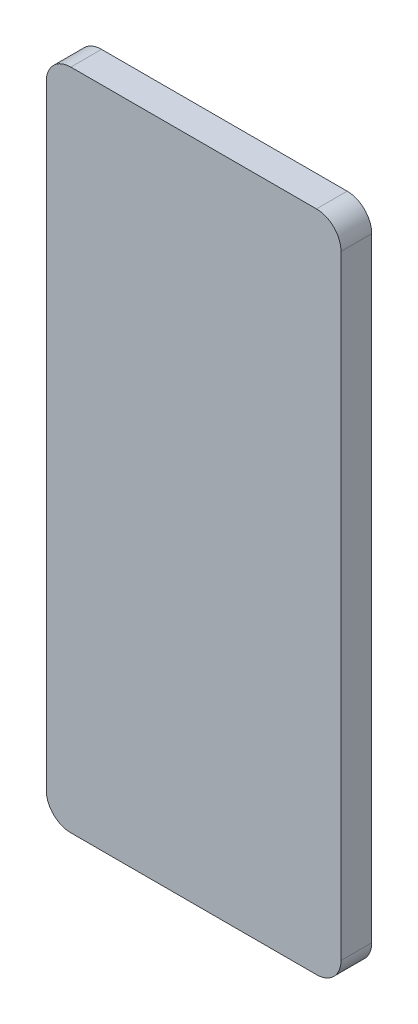
ISO-10303-21;
HEADER;
FILE_DESCRIPTION(('STEP AP214'),'2;1');
FILE_NAME('part.step','',(''),(''),'','','');
FILE_SCHEMA(('AUTOMOTIVE_DESIGN { 1 0 10303 214 1 1 1 1 }'));
ENDSEC;
DATA;
#1=APPLICATION_CONTEXT('core data for automotive mechanical design processes');
#2=APPLICATION_PROTOCOL_DEFINITION('international standard','automotive_design',2000,#1);
#3=PRODUCT_CONTEXT('',#1,'mechanical');
#4=PRODUCT('Part','Part','',(#3));
#5=PRODUCT_RELATED_PRODUCT_CATEGORY('part','',(#4));
#6=PRODUCT_DEFINITION_FORMATION('','',#4);
#7=PRODUCT_DEFINITION_CONTEXT('part definition',#1,'design');
#8=PRODUCT_DEFINITION('design','',#6,#7);
#9=PRODUCT_DEFINITION_SHAPE('','',#8);
#10=(LENGTH_UNIT() NAMED_UNIT(*) SI_UNIT(.MILLI.,.METRE.));
#11=(NAMED_UNIT(*) PLANE_ANGLE_UNIT() SI_UNIT($,.RADIAN.));
#12=(NAMED_UNIT(*) SI_UNIT($,.STERADIAN.) SOLID_ANGLE_UNIT());
#13=UNCERTAINTY_MEASURE_WITH_UNIT(LENGTH_MEASURE(1.E-05),#10,'distance_accuracy_value','');
#14=(GEOMETRIC_REPRESENTATION_CONTEXT(3) GLOBAL_UNCERTAINTY_ASSIGNED_CONTEXT((#13)) GLOBAL_UNIT_ASSIGNED_CONTEXT((#10,
#11,#12)) REPRESENTATION_CONTEXT('',''));
#15=CARTESIAN_POINT('',(0.,0.,0.));
#16=DIRECTION('',(0.,0.,1.));
#17=DIRECTION('',(1.,0.,0.));
#18=AXIS2_PLACEMENT_3D('',#15,#16,#17);
#19=CARTESIAN_POINT('',(-20.,-50.,-5.));
#20=DIRECTION('',(0.,0.,1.));
#21=DIRECTION('',(1.,0.,0.));
#22=AXIS2_PLACEMENT_3D('',#19,#20,#21);
#23=CYLINDRICAL_SURFACE('',#22,4.);
#24=CARTESIAN_POINT('',(-20.,-50.,0.));
#25=DIRECTION('',(0.,0.,1.));
#26=DIRECTION('',(-1.,0.,0.));
#27=AXIS2_PLACEMENT_3D('',#24,#25,#26);
#28=CIRCLE('',#27,4.);
#29=CARTESIAN_POINT('',(-24.,-50.,0.));
#30=VERTEX_POINT('',#29);
#31=CARTESIAN_POINT('',(-20.,-54.,0.));
#32=VERTEX_POINT('',#31);
#33=EDGE_CURVE('E133',#30,#32,#28,.T.);
#34=ORIENTED_EDGE('',*,*,#33,.F.);
#35=DIRECTION('',(0.,0.,1.));
#36=VECTOR('',#35,1.);
#37=CARTESIAN_POINT('',(-24.,-50.,-5.));
#38=LINE('',#37,#36);
#39=CARTESIAN_POINT('',(-24.,-50.,-5.));
#40=VERTEX_POINT('',#39);
#41=EDGE_CURVE('E11',#40,#30,#38,.T.);
#42=ORIENTED_EDGE('',*,*,#41,.F.);
#43=CARTESIAN_POINT('',(-20.,-50.,-5.));
#44=DIRECTION('',(0.,0.,1.));
#45=DIRECTION('',(-1.,0.,0.));
#46=AXIS2_PLACEMENT_3D('',#43,#44,#45);
#47=CIRCLE('',#46,4.);
#48=CARTESIAN_POINT('',(-20.,-54.,-5.));
#49=VERTEX_POINT('',#48);
#50=EDGE_CURVE('E153',#40,#49,#47,.T.);
#51=ORIENTED_EDGE('',*,*,#50,.T.);
#52=DIRECTION('',(0.,0.,1.));
#53=VECTOR('',#52,1.);
#54=CARTESIAN_POINT('',(-20.,-54.,-5.));
#55=LINE('',#54,#53);
#56=EDGE_CURVE('E39',#49,#32,#55,.T.);
#57=ORIENTED_EDGE('',*,*,#56,.T.);
#58=EDGE_LOOP('',(#34,#42,#51,#57));
#59=FACE_BOUND('',#58,.T.);
#60=ADVANCED_FACE('F36',(#59),#23,.T.);
#61=CARTESIAN_POINT('',(-24.,-50.,-5.));
#62=DIRECTION('',(-1.,0.,0.));
#63=DIRECTION('',(0.,0.,1.));
#64=AXIS2_PLACEMENT_3D('',#61,#62,#63);
#65=PLANE('',#64);
#66=DIRECTION('',(0.,-1.,0.));
#67=VECTOR('',#66,1.);
#68=CARTESIAN_POINT('',(-24.,-50.,0.));
#69=LINE('',#68,#67);
#70=CARTESIAN_POINT('',(-24.,50.,0.));
#71=VERTEX_POINT('',#70);
#72=EDGE_CURVE('E151',#71,#30,#69,.T.);
#73=ORIENTED_EDGE('',*,*,#72,.F.);
#74=DIRECTION('',(0.,0.,1.));
#75=VECTOR('',#74,1.);
#76=CARTESIAN_POINT('',(-24.,50.,-5.));
#77=LINE('',#76,#75);
#78=CARTESIAN_POINT('',(-24.,50.,-5.));
#79=VERTEX_POINT('',#78);
#80=EDGE_CURVE('E45',#79,#71,#77,.T.);
#81=ORIENTED_EDGE('',*,*,#80,.F.);
#82=DIRECTION('',(0.,-1.,0.));
#83=VECTOR('',#82,1.);
#84=CARTESIAN_POINT('',(-24.,-50.,-5.));
#85=LINE('',#84,#83);
#86=EDGE_CURVE('E123',#79,#40,#85,.T.);
#87=ORIENTED_EDGE('',*,*,#86,.T.);
#88=ORIENTED_EDGE('',*,*,#41,.T.);
#89=EDGE_LOOP('',(#73,#81,#87,#88));
#90=FACE_BOUND('',#89,.T.);
#91=ADVANCED_FACE('F165',(#90),#65,.T.);
#92=CARTESIAN_POINT('',(-20.,50.,-5.));
#93=DIRECTION('',(0.,0.,1.));
#94=DIRECTION('',(1.,0.,0.));
#95=AXIS2_PLACEMENT_3D('',#92,#93,#94);
#96=CYLINDRICAL_SURFACE('',#95,4.);
#97=CARTESIAN_POINT('',(-20.,50.,0.));
#98=DIRECTION('',(0.,0.,1.));
#99=DIRECTION('',(-1.,0.,0.));
#100=AXIS2_PLACEMENT_3D('',#97,#98,#99);
#101=CIRCLE('',#100,4.);
#102=CARTESIAN_POINT('',(-20.,54.,0.));
#103=VERTEX_POINT('',#102);
#104=EDGE_CURVE('E110',#103,#71,#101,.T.);
#105=ORIENTED_EDGE('',*,*,#104,.F.);
#106=DIRECTION('',(0.,0.,1.));
#107=VECTOR('',#106,1.);
#108=CARTESIAN_POINT('',(-20.,54.,-5.));
#109=LINE('',#108,#107);
#110=CARTESIAN_POINT('',(-20.,54.,-5.));
#111=VERTEX_POINT('',#110);
#112=EDGE_CURVE('E105',#111,#103,#109,.T.);
#113=ORIENTED_EDGE('',*,*,#112,.F.);
#114=CARTESIAN_POINT('',(-20.,50.,-5.));
#115=DIRECTION('',(0.,0.,1.));
#116=DIRECTION('',(-1.,0.,0.));
#117=AXIS2_PLACEMENT_3D('',#114,#115,#116);
#118=CIRCLE('',#117,4.);
#119=EDGE_CURVE('E108',#111,#79,#118,.T.);
#120=ORIENTED_EDGE('',*,*,#119,.T.);
#121=ORIENTED_EDGE('',*,*,#80,.T.);
#122=EDGE_LOOP('',(#105,#113,#120,#121));
#123=FACE_BOUND('',#122,.T.);
#124=ADVANCED_FACE('F107',(#123),#96,.T.);
#125=CARTESIAN_POINT('',(-20.,54.,-5.));
#126=DIRECTION('',(0.,1.,0.));
#127=DIRECTION('',(0.,0.,1.));
#128=AXIS2_PLACEMENT_3D('',#125,#126,#127);
#129=PLANE('',#128);
#130=DIRECTION('',(-1.,0.,0.));
#131=VECTOR('',#130,1.);
#132=CARTESIAN_POINT('',(-20.,54.,0.));
#133=LINE('',#132,#131);
#134=CARTESIAN_POINT('',(20.,54.,0.));
#135=VERTEX_POINT('',#134);
#136=EDGE_CURVE('E148',#135,#103,#133,.T.);
#137=ORIENTED_EDGE('',*,*,#136,.F.);
#138=DIRECTION('',(0.,0.,1.));
#139=VECTOR('',#138,1.);
#140=CARTESIAN_POINT('',(20.,54.,-5.));
#141=LINE('',#140,#139);
#142=CARTESIAN_POINT('',(20.,54.,-5.));
#143=VERTEX_POINT('',#142);
#144=EDGE_CURVE('E115',#143,#135,#141,.T.);
#145=ORIENTED_EDGE('',*,*,#144,.F.);
#146=DIRECTION('',(-1.,0.,0.));
#147=VECTOR('',#146,1.);
#148=CARTESIAN_POINT('',(-20.,54.,-5.));
#149=LINE('',#148,#147);
#150=EDGE_CURVE('E121',#143,#111,#149,.T.);
#151=ORIENTED_EDGE('',*,*,#150,.T.);
#152=ORIENTED_EDGE('',*,*,#112,.T.);
#153=EDGE_LOOP('',(#137,#145,#151,#152));
#154=FACE_BOUND('',#153,.T.);
#155=ADVANCED_FACE('F125',(#154),#129,.T.);
#156=CARTESIAN_POINT('',(20.,50.,-5.));
#157=DIRECTION('',(0.,0.,1.));
#158=DIRECTION('',(1.,0.,0.));
#159=AXIS2_PLACEMENT_3D('',#156,#157,#158);
#160=CYLINDRICAL_SURFACE('',#159,4.);
#161=CARTESIAN_POINT('',(20.,50.,0.));
#162=DIRECTION('',(0.,0.,1.));
#163=DIRECTION('',(-1.,0.,0.));
#164=AXIS2_PLACEMENT_3D('',#161,#162,#163);
#165=CIRCLE('',#164,4.);
#166=CARTESIAN_POINT('',(24.,50.,0.));
#167=VERTEX_POINT('',#166);
#168=EDGE_CURVE('E145',#167,#135,#165,.T.);
#169=ORIENTED_EDGE('',*,*,#168,.F.);
#170=DIRECTION('',(0.,0.,1.));
#171=VECTOR('',#170,1.);
#172=CARTESIAN_POINT('',(24.,50.,-5.));
#173=LINE('',#172,#171);
#174=CARTESIAN_POINT('',(24.,50.,-5.));
#175=VERTEX_POINT('',#174);
#176=EDGE_CURVE('E157',#175,#167,#173,.T.);
#177=ORIENTED_EDGE('',*,*,#176,.F.);
#178=CARTESIAN_POINT('',(20.,50.,-5.));
#179=DIRECTION('',(0.,0.,1.));
#180=DIRECTION('',(-1.,0.,0.));
#181=AXIS2_PLACEMENT_3D('',#178,#179,#180);
#182=CIRCLE('',#181,4.);
#183=EDGE_CURVE('E126',#175,#143,#182,.T.);
#184=ORIENTED_EDGE('',*,*,#183,.T.);
#185=ORIENTED_EDGE('',*,*,#144,.T.);
#186=EDGE_LOOP('',(#169,#177,#184,#185));
#187=FACE_BOUND('',#186,.T.);
#188=ADVANCED_FACE('F178',(#187),#160,.T.);
#189=CARTESIAN_POINT('',(24.,-50.,-5.));
#190=DIRECTION('',(1.,0.,0.));
#191=DIRECTION('',(0.,0.,-1.));
#192=AXIS2_PLACEMENT_3D('',#189,#190,#191);
#193=PLANE('',#192);
#194=DIRECTION('',(0.,1.,0.));
#195=VECTOR('',#194,1.);
#196=CARTESIAN_POINT('',(24.,-50.,0.));
#197=LINE('',#196,#195);
#198=CARTESIAN_POINT('',(24.,-50.,0.));
#199=VERTEX_POINT('',#198);
#200=EDGE_CURVE('E142',#199,#167,#197,.T.);
#201=ORIENTED_EDGE('',*,*,#200,.F.);
#202=DIRECTION('',(0.,0.,1.));
#203=VECTOR('',#202,1.);
#204=CARTESIAN_POINT('',(24.,-50.,-5.));
#205=LINE('',#204,#203);
#206=CARTESIAN_POINT('',(24.,-50.,-5.));
#207=VERTEX_POINT('',#206);
#208=EDGE_CURVE('E159',#207,#199,#205,.T.);
#209=ORIENTED_EDGE('',*,*,#208,.F.);
#210=DIRECTION('',(0.,1.,0.));
#211=VECTOR('',#210,1.);
#212=CARTESIAN_POINT('',(24.,-50.,-5.));
#213=LINE('',#212,#211);
#214=EDGE_CURVE('E128',#207,#175,#213,.T.);
#215=ORIENTED_EDGE('',*,*,#214,.T.);
#216=ORIENTED_EDGE('',*,*,#176,.T.);
#217=EDGE_LOOP('',(#201,#209,#215,#216));
#218=FACE_BOUND('',#217,.T.);
#219=ADVANCED_FACE('F181',(#218),#193,.T.);
#220=CARTESIAN_POINT('',(20.,-50.,-5.));
#221=DIRECTION('',(0.,0.,1.));
#222=DIRECTION('',(1.,0.,0.));
#223=AXIS2_PLACEMENT_3D('',#220,#221,#222);
#224=CYLINDRICAL_SURFACE('',#223,4.);
#225=CARTESIAN_POINT('',(20.,-50.,0.));
#226=DIRECTION('',(0.,0.,1.));
#227=DIRECTION('',(1.,0.,0.));
#228=AXIS2_PLACEMENT_3D('',#225,#226,#227);
#229=CIRCLE('',#228,4.);
#230=CARTESIAN_POINT('',(20.,-54.,0.));
#231=VERTEX_POINT('',#230);
#232=EDGE_CURVE('E139',#231,#199,#229,.T.);
#233=ORIENTED_EDGE('',*,*,#232,.F.);
#234=DIRECTION('',(0.,0.,1.));
#235=VECTOR('',#234,1.);
#236=CARTESIAN_POINT('',(20.,-54.,-5.));
#237=LINE('',#236,#235);
#238=CARTESIAN_POINT('',(20.,-54.,-5.));
#239=VERTEX_POINT('',#238);
#240=EDGE_CURVE('E160',#239,#231,#237,.T.);
#241=ORIENTED_EDGE('',*,*,#240,.F.);
#242=CARTESIAN_POINT('',(20.,-50.,-5.));
#243=DIRECTION('',(0.,0.,1.));
#244=DIRECTION('',(1.,0.,0.));
#245=AXIS2_PLACEMENT_3D('',#242,#243,#244);
#246=CIRCLE('',#245,4.);
#247=EDGE_CURVE('E276',#239,#207,#246,.T.);
#248=ORIENTED_EDGE('',*,*,#247,.T.);
#249=ORIENTED_EDGE('',*,*,#208,.T.);
#250=EDGE_LOOP('',(#233,#241,#248,#249));
#251=FACE_BOUND('',#250,.T.);
#252=ADVANCED_FACE('F185',(#251),#224,.T.);
#253=CARTESIAN_POINT('',(-20.,-54.,-5.));
#254=DIRECTION('',(0.,-1.,0.));
#255=DIRECTION('',(0.,0.,-1.));
#256=AXIS2_PLACEMENT_3D('',#253,#254,#255);
#257=PLANE('',#256);
#258=DIRECTION('',(1.,0.,0.));
#259=VECTOR('',#258,1.);
#260=CARTESIAN_POINT('',(-20.,-54.,0.));
#261=LINE('',#260,#259);
#262=EDGE_CURVE('E136',#32,#231,#261,.T.);
#263=ORIENTED_EDGE('',*,*,#262,.F.);
#264=ORIENTED_EDGE('',*,*,#56,.F.);
#265=DIRECTION('',(1.,0.,0.));
#266=VECTOR('',#265,1.);
#267=CARTESIAN_POINT('',(-20.,-54.,-5.));
#268=LINE('',#267,#266);
#269=EDGE_CURVE('E277',#49,#239,#268,.T.);
#270=ORIENTED_EDGE('',*,*,#269,.T.);
#271=ORIENTED_EDGE('',*,*,#240,.T.);
#272=EDGE_LOOP('',(#263,#264,#270,#271));
#273=FACE_BOUND('',#272,.T.);
#274=ADVANCED_FACE('F162',(#273),#257,.T.);
#275=CARTESIAN_POINT('',(-20.,-50.,-5.));
#276=DIRECTION('',(0.,0.,-1.));
#277=DIRECTION('',(-1.,0.,0.));
#278=AXIS2_PLACEMENT_3D('',#275,#276,#277);
#279=PLANE('',#278);
#280=ORIENTED_EDGE('',*,*,#50,.F.);
#281=ORIENTED_EDGE('',*,*,#86,.F.);
#282=ORIENTED_EDGE('',*,*,#119,.F.);
#283=ORIENTED_EDGE('',*,*,#150,.F.);
#284=ORIENTED_EDGE('',*,*,#183,.F.);
#285=ORIENTED_EDGE('',*,*,#214,.F.);
#286=ORIENTED_EDGE('',*,*,#247,.F.);
#287=ORIENTED_EDGE('',*,*,#269,.F.);
#288=EDGE_LOOP('',(#280,#281,#282,#283,#284,#285,#286,#287));
#289=FACE_BOUND('',#288,.T.);
#290=ADVANCED_FACE('F119',(#289),#279,.T.);
#291=CARTESIAN_POINT('',(-20.,-50.,0.));
#292=DIRECTION('',(0.,0.,-1.));
#293=DIRECTION('',(-1.,0.,0.));
#294=AXIS2_PLACEMENT_3D('',#291,#292,#293);
#295=PLANE('',#294);
#296=ORIENTED_EDGE('',*,*,#33,.T.);
#297=ORIENTED_EDGE('',*,*,#262,.T.);
#298=ORIENTED_EDGE('',*,*,#232,.T.);
#299=ORIENTED_EDGE('',*,*,#200,.T.);
#300=ORIENTED_EDGE('',*,*,#168,.T.);
#301=ORIENTED_EDGE('',*,*,#136,.T.);
#302=ORIENTED_EDGE('',*,*,#104,.T.);
#303=ORIENTED_EDGE('',*,*,#72,.T.);
#304=EDGE_LOOP('',(#296,#297,#298,#299,#300,#301,#302,#303));
#305=FACE_BOUND('',#304,.T.);
#306=ADVANCED_FACE('F164',(#305),#295,.F.);
#307=CLOSED_SHELL('',(#60,#91,#124,#155,#188,#219,#252,#274,#290,#306));
#308=MANIFOLD_SOLID_BREP('B2',#307);
#309=ADVANCED_BREP_SHAPE_REPRESENTATION('',(#18,#308),#14);
#310=SHAPE_DEFINITION_REPRESENTATION(#9,#309);
ENDSEC;
END-ISO-10303-21;
